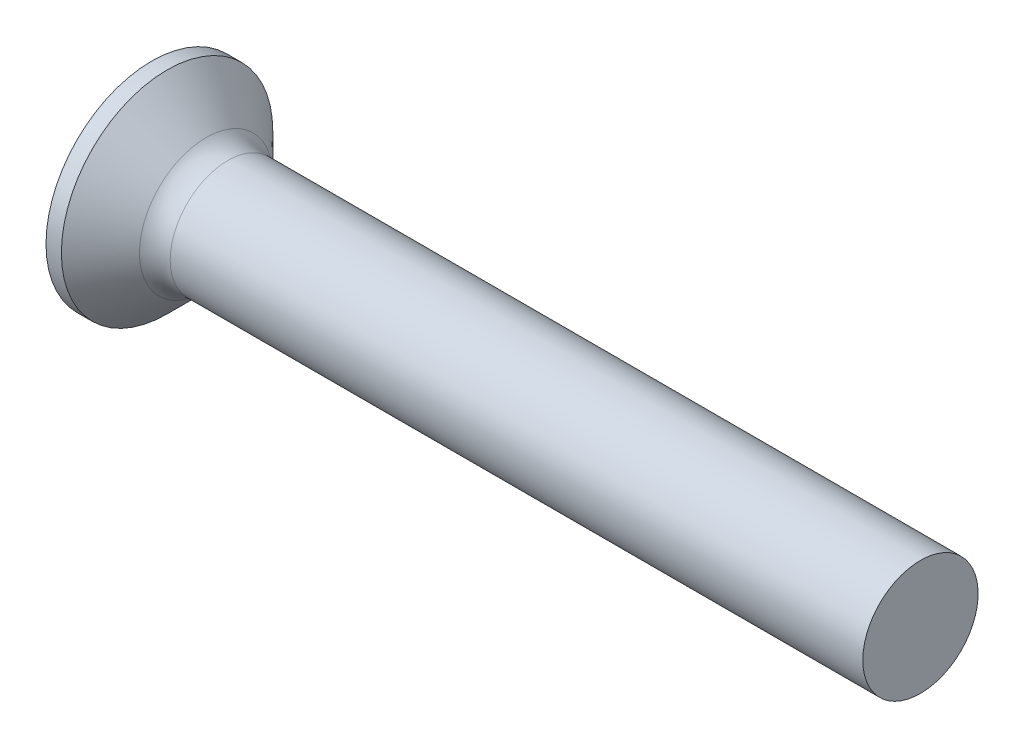
ISO-10303-21;
HEADER;
FILE_DESCRIPTION(('STEP AP214'),'2;1');
FILE_NAME('part.step','',(''),(''),'','','');
FILE_SCHEMA(('AUTOMOTIVE_DESIGN { 1 0 10303 214 1 1 1 1 }'));
ENDSEC;
DATA;
#1=APPLICATION_CONTEXT('core data for automotive mechanical design processes');
#2=APPLICATION_PROTOCOL_DEFINITION('international standard','automotive_design',2000,#1);
#3=PRODUCT_CONTEXT('',#1,'mechanical');
#4=PRODUCT('Part','Part','',(#3));
#5=PRODUCT_RELATED_PRODUCT_CATEGORY('part','',(#4));
#6=PRODUCT_DEFINITION_FORMATION('','',#4);
#7=PRODUCT_DEFINITION_CONTEXT('part definition',#1,'design');
#8=PRODUCT_DEFINITION('design','',#6,#7);
#9=PRODUCT_DEFINITION_SHAPE('','',#8);
#10=(LENGTH_UNIT() NAMED_UNIT(*) SI_UNIT(.MILLI.,.METRE.));
#11=(NAMED_UNIT(*) PLANE_ANGLE_UNIT() SI_UNIT($,.RADIAN.));
#12=(NAMED_UNIT(*) SI_UNIT($,.STERADIAN.) SOLID_ANGLE_UNIT());
#13=UNCERTAINTY_MEASURE_WITH_UNIT(LENGTH_MEASURE(1.E-05),#10,'distance_accuracy_value','');
#14=(GEOMETRIC_REPRESENTATION_CONTEXT(3) GLOBAL_UNCERTAINTY_ASSIGNED_CONTEXT((#13)) GLOBAL_UNIT_ASSIGNED_CONTEXT((#10,
#11,#12)) REPRESENTATION_CONTEXT('',''));
#15=CARTESIAN_POINT('',(0.,0.,0.));
#16=DIRECTION('',(0.,0.,1.));
#17=DIRECTION('',(1.,0.,0.));
#18=AXIS2_PLACEMENT_3D('',#15,#16,#17);
#19=CARTESIAN_POINT('',(2.01,-0.497851135403458,0.37));
#20=DIRECTION('',(0.,0.,-1.));
#21=DIRECTION('',(-1.,0.,0.));
#22=AXIS2_PLACEMENT_3D('',#19,#20,#21);
#23=PLANE('',#22);
#24=DIRECTION('',(0.,-1.,0.));
#25=VECTOR('',#24,1.);
#26=CARTESIAN_POINT('',(0.,1.5,0.37));
#27=LINE('',#26,#25);
#28=CARTESIAN_POINT('',(0.,-0.590157547916262,0.37));
#29=VERTEX_POINT('',#28);
#30=CARTESIAN_POINT('',(0.,-1.5,0.37));
#31=VERTEX_POINT('',#30);
#32=EDGE_CURVE('E461',#29,#31,#27,.T.);
#33=ORIENTED_EDGE('',*,*,#32,.F.);
#34=CARTESIAN_POINT('',(-1.01053649699026,-0.672102030078458,0.37));
#35=CARTESIAN_POINT('',(-0.799706058781647,-0.65526709888962,0.37));
#36=CARTESIAN_POINT('',(-0.588886212565098,-0.638297110577309,0.37));
#37=CARTESIAN_POINT('',(-0.167272662573758,-0.603984130523452,0.37));
#38=CARTESIAN_POINT('',(0.043521040593722,-0.586641131327184,0.37));
#39=CARTESIAN_POINT('',(0.465068838236452,-0.551479911668093,0.37));
#40=CARTESIAN_POINT('',(0.675822932725247,-0.533661691368078,0.37));
#41=CARTESIAN_POINT('',(1.09727362087867,-0.497387538868942,0.37));
#42=CARTESIAN_POINT('',(1.30797021528206,-0.478931615293403,0.37));
#43=CARTESIAN_POINT('',(1.67418894765493,-0.446067164114375,0.37));
#44=CARTESIAN_POINT('',(1.82972932594024,-0.431862501020784,0.37));
#45=CARTESIAN_POINT('',(2.14074770367772,-0.402797709732014,0.37));
#46=CARTESIAN_POINT('',(2.29622570364502,-0.387937587067169,0.37));
#47=CARTESIAN_POINT('',(2.60710169356699,-0.357305117929345,0.37));
#48=CARTESIAN_POINT('',(2.76249967848536,-0.341532719782114,0.37));
#49=CARTESIAN_POINT('',(2.99549070750468,-0.316847908272697,0.37));
#50=CARTESIAN_POINT('',(3.07313791127142,-0.308448465888147,0.37));
#51=CARTESIAN_POINT('',(3.22838341584044,-0.291202251038988,0.37));
#52=CARTESIAN_POINT('',(3.30598171607669,-0.282355473489552,0.370000000000001));
#53=CARTESIAN_POINT('',(3.38354828471668,-0.273232461280214,0.370000000000001));
#54=B_SPLINE_CURVE_WITH_KNOTS('',3,(#34,#35,#36,#37,#38,#39,#40,#41,#42,#43,#44,#45,#46,#47,#48,
#49,#50,#51,#52,#53),.UNSPECIFIED.,.F.,.F.,(4,2,2,2,2,2,2,2,2,4),(0.,0.634504777580944,
1.26902224771403,1.90353950046914,2.53804817608336,3.00661008454961,3.47516804035678,
3.94375256285268,4.17805198347564,4.41235406796205),.UNSPECIFIED.);
#55=CARTESIAN_POINT('',(2.01,-0.415013252800436,0.37));
#56=VERTEX_POINT('',#55);
#57=EDGE_CURVE('E217',#29,#56,#54,.T.);
#58=ORIENTED_EDGE('',*,*,#57,.T.);
#59=DIRECTION('',(0.,-1.,0.));
#60=VECTOR('',#59,1.);
#61=CARTESIAN_POINT('',(2.01,0.497851135403458,0.37));
#62=LINE('',#61,#60);
#63=CARTESIAN_POINT('',(2.01,-0.497851135403458,0.37));
#64=VERTEX_POINT('',#63);
#65=EDGE_CURVE('E370',#56,#64,#62,.T.);
#66=ORIENTED_EDGE('',*,*,#65,.T.);
#67=DIRECTION('',(0.894934391398442,0.446197753347436,0.));
#68=VECTOR('',#67,1.);
#69=CARTESIAN_POINT('',(0.,-1.5,0.37));
#70=LINE('',#69,#68);
#71=EDGE_CURVE('E469',#31,#64,#70,.T.);
#72=ORIENTED_EDGE('',*,*,#71,.F.);
#73=EDGE_LOOP('',(#33,#58,#66,#72));
#74=FACE_BOUND('',#73,.T.);
#75=ADVANCED_FACE('F38',(#74),#23,.T.);
#76=CARTESIAN_POINT('',(2.01,0.497851135403458,0.37));
#77=VERTEX_POINT('',#76);
#78=CARTESIAN_POINT('',(2.01,0.415013252800436,0.37));
#79=VERTEX_POINT('',#78);
#80=EDGE_CURVE('E366',#77,#79,#62,.T.);
#81=ORIENTED_EDGE('',*,*,#80,.T.);
#82=CARTESIAN_POINT('',(-1.01053649699026,0.672102030078458,0.37));
#83=CARTESIAN_POINT('',(-0.799706058781647,0.65526709888962,0.37));
#84=CARTESIAN_POINT('',(-0.588886212565098,0.638297110577309,0.37));
#85=CARTESIAN_POINT('',(-0.167272662573758,0.603984130523452,0.37));
#86=CARTESIAN_POINT('',(0.0435210405937223,0.586641131327184,0.37));
#87=CARTESIAN_POINT('',(0.465068838236453,0.551479911668093,0.37));
#88=CARTESIAN_POINT('',(0.675822932725247,0.533661691368078,0.37));
#89=CARTESIAN_POINT('',(1.09727362087867,0.497387538868942,0.37));
#90=CARTESIAN_POINT('',(1.30797021528206,0.478931615293403,0.37));
#91=CARTESIAN_POINT('',(1.67418894765493,0.446067164114375,0.37));
#92=CARTESIAN_POINT('',(1.82972932594024,0.431862501020784,0.37));
#93=CARTESIAN_POINT('',(2.14074770367772,0.402797709732014,0.37));
#94=CARTESIAN_POINT('',(2.29622570364503,0.387937587067169,0.37));
#95=CARTESIAN_POINT('',(2.60710169356699,0.357305117929345,0.37));
#96=CARTESIAN_POINT('',(2.76249967848536,0.341532719782114,0.37));
#97=CARTESIAN_POINT('',(2.99549070750468,0.316847908272697,0.37));
#98=CARTESIAN_POINT('',(3.07313791127142,0.308448465888147,0.37));
#99=CARTESIAN_POINT('',(3.22838341584044,0.291202251038988,0.37));
#100=CARTESIAN_POINT('',(3.30598171607669,0.282355473489552,0.37));
#101=CARTESIAN_POINT('',(3.38354828471668,0.273232461280214,0.37));
#102=B_SPLINE_CURVE_WITH_KNOTS('',3,(#82,#83,#84,#85,#86,#87,#88,#89,#90,#91,#92,#93,#94,#95,
#96,#97,#98,#99,#100,#101),.UNSPECIFIED.,.F.,.F.,(4,2,2,2,2,2,2,2,2,4),(0.,0.634504777580944,
1.26902224771403,1.90353950046914,2.53804817608336,3.00661008454961,3.47516804035678,
3.94375256285268,4.17805198347564,4.41235406796206),.UNSPECIFIED.);
#103=CARTESIAN_POINT('',(0.,0.590157547916262,0.37));
#104=VERTEX_POINT('',#103);
#105=EDGE_CURVE('E210',#79,#104,#102,.F.);
#106=ORIENTED_EDGE('',*,*,#105,.T.);
#107=CARTESIAN_POINT('',(0.,1.5,0.37));
#108=VERTEX_POINT('',#107);
#109=EDGE_CURVE('E463',#108,#104,#27,.T.);
#110=ORIENTED_EDGE('',*,*,#109,.F.);
#111=DIRECTION('',(0.894934391398442,-0.446197753347436,0.));
#112=VECTOR('',#111,1.);
#113=CARTESIAN_POINT('',(0.,1.5,0.37));
#114=LINE('',#113,#112);
#115=EDGE_CURVE('E61',#108,#77,#114,.T.);
#116=ORIENTED_EDGE('',*,*,#115,.T.);
#117=EDGE_LOOP('',(#81,#106,#110,#116));
#118=FACE_BOUND('',#117,.T.);
#119=ADVANCED_FACE('F192',(#118),#23,.T.);
#120=CARTESIAN_POINT('',(2.01,0.497851135403458,-0.37));
#121=DIRECTION('',(0.,0.,1.));
#122=DIRECTION('',(1.,0.,0.));
#123=AXIS2_PLACEMENT_3D('',#120,#121,#122);
#124=PLANE('',#123);
#125=DIRECTION('',(0.,1.,0.));
#126=VECTOR('',#125,1.);
#127=CARTESIAN_POINT('',(2.01,-0.497851135403458,-0.37));
#128=LINE('',#127,#126);
#129=CARTESIAN_POINT('',(2.01,-0.497851135403458,-0.37));
#130=VERTEX_POINT('',#129);
#131=CARTESIAN_POINT('',(2.01,-0.415013252800436,-0.37));
#132=VERTEX_POINT('',#131);
#133=EDGE_CURVE('E379',#130,#132,#128,.T.);
#134=ORIENTED_EDGE('',*,*,#133,.T.);
#135=CARTESIAN_POINT('',(-1.01053649699026,-0.672102030078459,-0.369999999999999));
#136=CARTESIAN_POINT('',(-0.799706058781647,-0.65526709888962,-0.369999999999999));
#137=CARTESIAN_POINT('',(-0.588886212565098,-0.63829711057731,-0.369999999999999));
#138=CARTESIAN_POINT('',(-0.167272662573758,-0.603984130523453,-0.369999999999999));
#139=CARTESIAN_POINT('',(0.0435210405937223,-0.586641131327185,-0.369999999999999));
#140=CARTESIAN_POINT('',(0.465068838236453,-0.551479911668094,-0.369999999999999));
#141=CARTESIAN_POINT('',(0.675822932725247,-0.533661691368078,-0.369999999999999));
#142=CARTESIAN_POINT('',(1.09727362087867,-0.497387538868943,-0.369999999999999));
#143=CARTESIAN_POINT('',(1.30797021528206,-0.478931615293404,-0.37));
#144=CARTESIAN_POINT('',(1.67418894765493,-0.446067164114376,-0.37));
#145=CARTESIAN_POINT('',(1.82972932594024,-0.431862501020785,-0.37));
#146=CARTESIAN_POINT('',(2.14074770367772,-0.402797709732015,-0.37));
#147=CARTESIAN_POINT('',(2.29622570364503,-0.387937587067169,-0.37));
#148=CARTESIAN_POINT('',(2.60710169356699,-0.357305117929345,-0.37));
#149=CARTESIAN_POINT('',(2.76249967848536,-0.341532719782114,-0.37));
#150=CARTESIAN_POINT('',(2.99549070750468,-0.316847908272697,-0.37));
#151=CARTESIAN_POINT('',(3.07313791127142,-0.308448465888147,-0.37));
#152=CARTESIAN_POINT('',(3.22838341584044,-0.291202251038988,-0.37));
#153=CARTESIAN_POINT('',(3.30598171607669,-0.282355473489552,-0.37));
#154=CARTESIAN_POINT('',(3.38354828471668,-0.273232461280214,-0.37));
#155=B_SPLINE_CURVE_WITH_KNOTS('',3,(#135,#136,#137,#138,#139,#140,#141,#142,#143,#144,#145,
#146,#147,#148,#149,#150,#151,#152,#153,#154),.UNSPECIFIED.,.F.,.F.,(4,2,2,2,2,2,2,2,2,4),(0.,
0.634504777580944,1.26902224771403,1.90353950046914,2.53804817608336,3.00661008454961,
3.47516804035678,3.94375256285268,4.17805198347564,4.41235406796206),.UNSPECIFIED.);
#156=CARTESIAN_POINT('',(0.,-0.590157547916263,-0.369999999999999));
#157=VERTEX_POINT('',#156);
#158=EDGE_CURVE('E273',#132,#157,#155,.F.);
#159=ORIENTED_EDGE('',*,*,#158,.T.);
#160=DIRECTION('',(0.,1.,0.));
#161=VECTOR('',#160,1.);
#162=CARTESIAN_POINT('',(0.,-1.5,-0.369999999999999));
#163=LINE('',#162,#161);
#164=CARTESIAN_POINT('',(0.,-1.5,-0.369999999999999));
#165=VERTEX_POINT('',#164);
#166=EDGE_CURVE('E462',#165,#157,#163,.T.);
#167=ORIENTED_EDGE('',*,*,#166,.F.);
#168=DIRECTION('',(0.894934391398442,0.446197753347436,0.));
#169=VECTOR('',#168,1.);
#170=CARTESIAN_POINT('',(0.,-1.5,-0.369999999999999));
#171=LINE('',#170,#169);
#172=EDGE_CURVE('E472',#165,#130,#171,.T.);
#173=ORIENTED_EDGE('',*,*,#172,.T.);
#174=EDGE_LOOP('',(#134,#159,#167,#173));
#175=FACE_BOUND('',#174,.T.);
#176=ADVANCED_FACE('F198',(#175),#124,.T.);
#177=CARTESIAN_POINT('',(0.,0.590157547916263,-0.369999999999999));
#178=VERTEX_POINT('',#177);
#179=CARTESIAN_POINT('',(0.,1.5,-0.369999999999999));
#180=VERTEX_POINT('',#179);
#181=EDGE_CURVE('E468',#178,#180,#163,.T.);
#182=ORIENTED_EDGE('',*,*,#181,.F.);
#183=CARTESIAN_POINT('',(-1.01053649699026,0.672102030078459,-0.369999999999999));
#184=CARTESIAN_POINT('',(-0.799706058781646,0.65526709888962,-0.369999999999999));
#185=CARTESIAN_POINT('',(-0.588886212565098,0.638297110577309,-0.369999999999999));
#186=CARTESIAN_POINT('',(-0.167272662573758,0.603984130523452,-0.369999999999999));
#187=CARTESIAN_POINT('',(0.0435210405937222,0.586641131327184,-0.369999999999999));
#188=CARTESIAN_POINT('',(0.465068838236452,0.551479911668094,-0.369999999999999));
#189=CARTESIAN_POINT('',(0.675822932725247,0.533661691368078,-0.369999999999999));
#190=CARTESIAN_POINT('',(1.09727362087867,0.497387538868942,-0.37));
#191=CARTESIAN_POINT('',(1.30797021528206,0.478931615293403,-0.37));
#192=CARTESIAN_POINT('',(1.67418894765493,0.446067164114375,-0.37));
#193=CARTESIAN_POINT('',(1.82972932594024,0.431862501020785,-0.37));
#194=CARTESIAN_POINT('',(2.14074770367772,0.402797709732015,-0.37));
#195=CARTESIAN_POINT('',(2.29622570364502,0.387937587067169,-0.37));
#196=CARTESIAN_POINT('',(2.60710169356699,0.357305117929345,-0.37));
#197=CARTESIAN_POINT('',(2.76249967848536,0.341532719782114,-0.37));
#198=CARTESIAN_POINT('',(2.99549070750468,0.316847908272697,-0.37));
#199=CARTESIAN_POINT('',(3.07313791127142,0.308448465888147,-0.37));
#200=CARTESIAN_POINT('',(3.22838341584044,0.291202251038988,-0.37));
#201=CARTESIAN_POINT('',(3.30598171607669,0.282355473489552,-0.37));
#202=CARTESIAN_POINT('',(3.38354828471668,0.273232461280214,-0.37));
#203=B_SPLINE_CURVE_WITH_KNOTS('',3,(#183,#184,#185,#186,#187,#188,#189,#190,#191,#192,#193,
#194,#195,#196,#197,#198,#199,#200,#201,#202),.UNSPECIFIED.,.F.,.F.,(4,2,2,2,2,2,2,2,2,4),(0.,
0.634504777580944,1.26902224771403,1.90353950046914,2.53804817608336,3.00661008454961,
3.47516804035678,3.94375256285268,4.17805198347564,4.41235406796206),.UNSPECIFIED.);
#204=CARTESIAN_POINT('',(2.01,0.415013252800436,-0.37));
#205=VERTEX_POINT('',#204);
#206=EDGE_CURVE('E267',#178,#205,#203,.T.);
#207=ORIENTED_EDGE('',*,*,#206,.T.);
#208=CARTESIAN_POINT('',(2.01,0.497851135403459,-0.37));
#209=VERTEX_POINT('',#208);
#210=EDGE_CURVE('E381',#205,#209,#128,.T.);
#211=ORIENTED_EDGE('',*,*,#210,.T.);
#212=DIRECTION('',(0.894934391398442,-0.446197753347436,0.));
#213=VECTOR('',#212,1.);
#214=CARTESIAN_POINT('',(0.,1.5,-0.369999999999999));
#215=LINE('',#214,#213);
#216=EDGE_CURVE('E378',#180,#209,#215,.T.);
#217=ORIENTED_EDGE('',*,*,#216,.F.);
#218=EDGE_LOOP('',(#182,#207,#211,#217));
#219=FACE_BOUND('',#218,.T.);
#220=ADVANCED_FACE('F479',(#219),#124,.T.);
#221=CARTESIAN_POINT('',(2.01,-0.497851135403458,-0.37));
#222=DIRECTION('',(-1.,0.,0.));
#223=DIRECTION('',(0.,0.,1.));
#224=AXIS2_PLACEMENT_3D('',#221,#222,#223);
#225=PLANE('',#224);
#226=DIRECTION('',(0.,-1.,0.));
#227=VECTOR('',#226,1.);
#228=CARTESIAN_POINT('',(2.01,0.369999999999998,0.49785113540346));
#229=LINE('',#228,#227);
#230=CARTESIAN_POINT('',(2.01,-0.247548473995472,0.497851135403457));
#231=VERTEX_POINT('',#230);
#232=CARTESIAN_POINT('',(2.01,-0.370000000000002,0.497851135403457));
#233=VERTEX_POINT('',#232);
#234=EDGE_CURVE('E451',#231,#233,#229,.T.);
#235=ORIENTED_EDGE('',*,*,#234,.F.);
#236=CARTESIAN_POINT('',(2.01,0.,0.));
#237=DIRECTION('',(-1.,0.,0.));
#238=DIRECTION('',(0.,0.,1.));
#239=AXIS2_PLACEMENT_3D('',#236,#237,#238);
#240=CIRCLE('',#239,0.555999999999999);
#241=CARTESIAN_POINT('',(2.01,-0.370000000000002,0.415013252800435));
#242=VERTEX_POINT('',#241);
#243=EDGE_CURVE('E53',#242,#231,#240,.T.);
#244=ORIENTED_EDGE('',*,*,#243,.F.);
#245=DIRECTION('',(0.,0.,-1.));
#246=VECTOR('',#245,1.);
#247=CARTESIAN_POINT('',(2.01,-0.370000000000002,0.497851135403457));
#248=LINE('',#247,#246);
#249=EDGE_CURVE('E452',#233,#242,#248,.T.);
#250=ORIENTED_EDGE('',*,*,#249,.F.);
#251=EDGE_LOOP('',(#235,#244,#250));
#252=FACE_BOUND('',#251,.T.);
#253=ADVANCED_FACE('F494',(#252),#225,.T.);
#254=ORIENTED_EDGE('',*,*,#65,.F.);
#255=CARTESIAN_POINT('',(2.01,-0.497851135403458,0.247548473995471));
#256=VERTEX_POINT('',#255);
#257=EDGE_CURVE('E335',#256,#56,#240,.T.);
#258=ORIENTED_EDGE('',*,*,#257,.F.);
#259=DIRECTION('',(0.,0.,-1.));
#260=VECTOR('',#259,1.);
#261=CARTESIAN_POINT('',(2.01,-0.497851135403458,0.37));
#262=LINE('',#261,#260);
#263=EDGE_CURVE('E372',#64,#256,#262,.T.);
#264=ORIENTED_EDGE('',*,*,#263,.F.);
#265=EDGE_LOOP('',(#254,#258,#264));
#266=FACE_BOUND('',#265,.T.);
#267=ADVANCED_FACE('F616',(#266),#225,.T.);
#268=CARTESIAN_POINT('',(2.01,-0.497851135403458,-0.247548473995471));
#269=VERTEX_POINT('',#268);
#270=EDGE_CURVE('E369',#269,#130,#262,.T.);
#271=ORIENTED_EDGE('',*,*,#270,.F.);
#272=EDGE_CURVE('E340',#132,#269,#240,.T.);
#273=ORIENTED_EDGE('',*,*,#272,.F.);
#274=ORIENTED_EDGE('',*,*,#133,.F.);
#275=EDGE_LOOP('',(#271,#273,#274));
#276=FACE_BOUND('',#275,.T.);
#277=ADVANCED_FACE('F627',(#276),#225,.T.);
#278=CARTESIAN_POINT('',(2.01,-0.369999999999999,-0.415013252800437));
#279=VERTEX_POINT('',#278);
#280=CARTESIAN_POINT('',(2.01,-0.369999999999999,-0.497851135403459));
#281=VERTEX_POINT('',#280);
#282=EDGE_CURVE('E450',#279,#281,#248,.T.);
#283=ORIENTED_EDGE('',*,*,#282,.F.);
#284=CARTESIAN_POINT('',(2.01,-0.24754847399547,-0.497851135403459));
#285=VERTEX_POINT('',#284);
#286=EDGE_CURVE('E345',#285,#279,#240,.T.);
#287=ORIENTED_EDGE('',*,*,#286,.F.);
#288=DIRECTION('',(0.,1.,0.));
#289=VECTOR('',#288,1.);
#290=CARTESIAN_POINT('',(2.01,-0.369999999999999,-0.497851135403459));
#291=LINE('',#290,#289);
#292=EDGE_CURVE('E446',#281,#285,#291,.T.);
#293=ORIENTED_EDGE('',*,*,#292,.F.);
#294=EDGE_LOOP('',(#283,#287,#293));
#295=FACE_BOUND('',#294,.T.);
#296=ADVANCED_FACE('F489',(#295),#225,.T.);
#297=CARTESIAN_POINT('',(2.01,0.247548473995473,-0.497851135403457));
#298=VERTEX_POINT('',#297);
#299=CARTESIAN_POINT('',(2.01,0.370000000000002,-0.497851135403457));
#300=VERTEX_POINT('',#299);
#301=EDGE_CURVE('E454',#298,#300,#291,.T.);
#302=ORIENTED_EDGE('',*,*,#301,.F.);
#303=CARTESIAN_POINT('',(2.01,0.370000000000001,-0.415013252800435));
#304=VERTEX_POINT('',#303);
#305=EDGE_CURVE('E350',#304,#298,#240,.T.);
#306=ORIENTED_EDGE('',*,*,#305,.F.);
#307=DIRECTION('',(0.,0.,1.));
#308=VECTOR('',#307,1.);
#309=CARTESIAN_POINT('',(2.01,0.370000000000002,-0.497851135403457));
#310=LINE('',#309,#308);
#311=EDGE_CURVE('E456',#300,#304,#310,.T.);
#312=ORIENTED_EDGE('',*,*,#311,.F.);
#313=EDGE_LOOP('',(#302,#306,#312));
#314=FACE_BOUND('',#313,.T.);
#315=ADVANCED_FACE('F483',(#314),#225,.T.);
#316=ORIENTED_EDGE('',*,*,#210,.F.);
#317=CARTESIAN_POINT('',(2.01,0.497851135403458,-0.247548473995471));
#318=VERTEX_POINT('',#317);
#319=EDGE_CURVE('E355',#318,#205,#240,.T.);
#320=ORIENTED_EDGE('',*,*,#319,.F.);
#321=DIRECTION('',(0.,0.,1.));
#322=VECTOR('',#321,1.);
#323=CARTESIAN_POINT('',(2.01,0.497851135403459,-0.37));
#324=LINE('',#323,#322);
#325=EDGE_CURVE('E374',#209,#318,#324,.T.);
#326=ORIENTED_EDGE('',*,*,#325,.F.);
#327=EDGE_LOOP('',(#316,#320,#326));
#328=FACE_BOUND('',#327,.T.);
#329=ADVANCED_FACE('F481',(#328),#225,.T.);
#330=CARTESIAN_POINT('',(2.01,0.497851135403458,0.24754847399547));
#331=VERTEX_POINT('',#330);
#332=EDGE_CURVE('E367',#331,#77,#324,.T.);
#333=ORIENTED_EDGE('',*,*,#332,.F.);
#334=EDGE_CURVE('E333',#79,#331,#240,.T.);
#335=ORIENTED_EDGE('',*,*,#334,.F.);
#336=ORIENTED_EDGE('',*,*,#80,.F.);
#337=EDGE_LOOP('',(#333,#335,#336));
#338=FACE_BOUND('',#337,.T.);
#339=ADVANCED_FACE('F365',(#338),#225,.T.);
#340=CARTESIAN_POINT('',(0.,-1.5,-0.369999999999999));
#341=DIRECTION('',(-0.446197753347436,0.894934391398443,0.));
#342=DIRECTION('',(-0.894934391398442,-0.446197753347436,0.));
#343=AXIS2_PLACEMENT_3D('',#340,#341,#342);
#344=PLANE('',#343);
#345=ORIENTED_EDGE('',*,*,#263,.T.);
#346=CARTESIAN_POINT('',(2.86902919914418,-0.0695550475538963,0.));
#347=DIRECTION('',(-0.446197753347436,0.894934391398443,0.));
#348=DIRECTION('',(-0.894934391398443,-0.446197753347436,0.));
#349=AXIS2_PLACEMENT_3D('',#346,#347,#348);
#350=ELLIPSE('',#349,1.11145971268776,0.491029001453358);
#351=EDGE_CURVE('E285',#256,#269,#350,.F.);
#352=ORIENTED_EDGE('',*,*,#351,.T.);
#353=ORIENTED_EDGE('',*,*,#270,.T.);
#354=ORIENTED_EDGE('',*,*,#172,.F.);
#355=DIRECTION('',(0.,0.,-1.));
#356=VECTOR('',#355,1.);
#357=CARTESIAN_POINT('',(0.,-1.5,0.37));
#358=LINE('',#357,#356);
#359=EDGE_CURVE('E386',#31,#165,#358,.T.);
#360=ORIENTED_EDGE('',*,*,#359,.F.);
#361=ORIENTED_EDGE('',*,*,#71,.T.);
#362=EDGE_LOOP('',(#345,#352,#353,#354,#360,#361));
#363=FACE_BOUND('',#362,.T.);
#364=ADVANCED_FACE('F204',(#363),#344,.T.);
#365=CARTESIAN_POINT('',(0.,1.5,0.37));
#366=DIRECTION('',(-0.446197753347436,-0.894934391398443,0.));
#367=DIRECTION('',(0.894934391398442,-0.446197753347436,0.));
#368=AXIS2_PLACEMENT_3D('',#365,#366,#367);
#369=PLANE('',#368);
#370=ORIENTED_EDGE('',*,*,#325,.T.);
#371=CARTESIAN_POINT('',(2.86902919914418,0.0695550475538961,0.));
#372=DIRECTION('',(-0.446197753347436,-0.894934391398443,0.));
#373=DIRECTION('',(-0.894934391398443,0.446197753347436,0.));
#374=AXIS2_PLACEMENT_3D('',#371,#372,#373);
#375=ELLIPSE('',#374,1.11145971268776,0.491029001453358);
#376=EDGE_CURVE('E290',#318,#331,#375,.F.);
#377=ORIENTED_EDGE('',*,*,#376,.T.);
#378=ORIENTED_EDGE('',*,*,#332,.T.);
#379=ORIENTED_EDGE('',*,*,#115,.F.);
#380=DIRECTION('',(0.,0.,1.));
#381=VECTOR('',#380,1.);
#382=CARTESIAN_POINT('',(0.,1.5,-0.369999999999999));
#383=LINE('',#382,#381);
#384=EDGE_CURVE('E458',#180,#108,#383,.T.);
#385=ORIENTED_EDGE('',*,*,#384,.F.);
#386=ORIENTED_EDGE('',*,*,#216,.T.);
#387=EDGE_LOOP('',(#370,#377,#378,#379,#385,#386));
#388=FACE_BOUND('',#387,.T.);
#389=ADVANCED_FACE('F477',(#388),#369,.T.);
#390=CARTESIAN_POINT('',(2.01,-0.369999999999999,-0.497851135403459));
#391=DIRECTION('',(0.,1.,0.));
#392=DIRECTION('',(-1.,0.,0.));
#393=AXIS2_PLACEMENT_3D('',#390,#391,#392);
#394=PLANE('',#393);
#395=DIRECTION('',(0.,0.,-1.));
#396=VECTOR('',#395,1.);
#397=CARTESIAN_POINT('',(0.,-0.370000000000005,1.5));
#398=LINE('',#397,#396);
#399=CARTESIAN_POINT('',(0.,-0.369999999999998,-0.590157547916264));
#400=VERTEX_POINT('',#399);
#401=CARTESIAN_POINT('',(0.,-0.369999999999995,-1.5));
#402=VERTEX_POINT('',#401);
#403=EDGE_CURVE('E428',#400,#402,#398,.T.);
#404=ORIENTED_EDGE('',*,*,#403,.F.);
#405=CARTESIAN_POINT('',(-1.01053649691082,-0.369999999999997,-0.672102030072118));
#406=CARTESIAN_POINT('',(-0.799706058711029,-0.369999999999998,-0.655267098883948));
#407=CARTESIAN_POINT('',(-0.588886212503303,-0.369999999999998,-0.638297110572312));
#408=CARTESIAN_POINT('',(-0.167272662529609,-0.369999999999998,-0.603984130519828));
#409=CARTESIAN_POINT('',(0.0435210406290478,-0.369999999999998,-0.586641131324259));
#410=CARTESIAN_POINT('',(0.465068838244709,-0.369999999999998,-0.551479911667386));
#411=CARTESIAN_POINT('',(0.67582293271526,-0.369999999999998,-0.53366169136891));
#412=CARTESIAN_POINT('',(1.09727362083221,-0.369999999999998,-0.497387538872971));
#413=CARTESIAN_POINT('',(1.30797021521736,-0.369999999999999,-0.47893161529909));
#414=CARTESIAN_POINT('',(1.67418894757201,-0.369999999999999,-0.446067164121906));
#415=CARTESIAN_POINT('',(1.82972932585734,-0.369999999999999,-0.431862501028415));
#416=CARTESIAN_POINT('',(2.14074770359484,-0.369999999999999,-0.40279770973988));
#417=CARTESIAN_POINT('',(2.29622570356215,-0.369999999999999,-0.38793758707517));
#418=CARTESIAN_POINT('',(2.60710169348415,-0.369999999999999,-0.357305117937677));
#419=CARTESIAN_POINT('',(2.76249967840253,-0.369999999999999,-0.34153271979064));
#420=CARTESIAN_POINT('',(2.99549070742189,-0.369999999999999,-0.316847908281594));
#421=CARTESIAN_POINT('',(3.07313791118864,-0.369999999999999,-0.308448465897182));
#422=CARTESIAN_POINT('',(3.22838341575769,-0.369999999999999,-0.291202251048339));
#423=CARTESIAN_POINT('',(3.30598171599396,-0.37,-0.282355473499082));
#424=CARTESIAN_POINT('',(3.38354828463398,-0.37,-0.27323246128995));
#425=B_SPLINE_CURVE_WITH_KNOTS('',3,(#405,#406,#407,#408,#409,#410,#411,#412,#413,#414,#415,
#416,#417,#418,#419,#420,#421,#422,#423,#424),.UNSPECIFIED.,.F.,.F.,(4,2,2,2,2,2,2,2,2,4),(0.,
0.634504777554396,1.26902224766093,1.90353950036111,2.53804817592041,3.00661008438666,
3.47516804019383,3.94375256268972,4.17805198331267,4.41235406779909),.UNSPECIFIED.);
#426=EDGE_CURVE('E259',#400,#279,#425,.T.);
#427=ORIENTED_EDGE('',*,*,#426,.T.);
#428=ORIENTED_EDGE('',*,*,#282,.T.);
#429=DIRECTION('',(0.894934391398442,0.,0.446197753347436));
#430=VECTOR('',#429,1.);
#431=CARTESIAN_POINT('',(0.,-0.369999999999995,-1.5));
#432=LINE('',#431,#430);
#433=EDGE_CURVE('E435',#402,#281,#432,.T.);
#434=ORIENTED_EDGE('',*,*,#433,.F.);
#435=EDGE_LOOP('',(#404,#427,#428,#434));
#436=FACE_BOUND('',#435,.T.);
#437=ADVANCED_FACE('F681',(#436),#394,.T.);
#438=CARTESIAN_POINT('',(2.01,0.369999999999998,0.49785113540346));
#439=DIRECTION('',(0.,-1.,0.));
#440=DIRECTION('',(1.,0.,0.));
#441=AXIS2_PLACEMENT_3D('',#438,#439,#440);
#442=PLANE('',#441);
#443=ORIENTED_EDGE('',*,*,#311,.T.);
#444=CARTESIAN_POINT('',(-1.01053649691082,0.370000000000001,-0.672102030072116));
#445=CARTESIAN_POINT('',(-0.799706058711029,0.370000000000001,-0.655267098883946));
#446=CARTESIAN_POINT('',(-0.588886212503304,0.370000000000001,-0.63829711057231));
#447=CARTESIAN_POINT('',(-0.16727266252961,0.370000000000001,-0.603984130519826));
#448=CARTESIAN_POINT('',(0.0435210406290473,0.370000000000001,-0.586641131324257));
#449=CARTESIAN_POINT('',(0.465068838244709,0.370000000000001,-0.551479911667383));
#450=CARTESIAN_POINT('',(0.67582293271526,0.370000000000001,-0.533661691368908));
#451=CARTESIAN_POINT('',(1.09727362083221,0.370000000000001,-0.497387538872969));
#452=CARTESIAN_POINT('',(1.30797021521736,0.370000000000001,-0.478931615299088));
#453=CARTESIAN_POINT('',(1.67418894757201,0.370000000000001,-0.446067164121904));
#454=CARTESIAN_POINT('',(1.82972932585734,0.370000000000001,-0.431862501028413));
#455=CARTESIAN_POINT('',(2.14074770359484,0.370000000000001,-0.402797709739878));
#456=CARTESIAN_POINT('',(2.29622570356215,0.370000000000001,-0.387937587075168));
#457=CARTESIAN_POINT('',(2.60710169348415,0.370000000000001,-0.357305117937674));
#458=CARTESIAN_POINT('',(2.76249967840253,0.370000000000001,-0.341532719790638));
#459=CARTESIAN_POINT('',(2.99549070742189,0.370000000000001,-0.316847908281592));
#460=CARTESIAN_POINT('',(3.07313791118864,0.370000000000001,-0.30844846589718));
#461=CARTESIAN_POINT('',(3.22838341575769,0.370000000000001,-0.291202251048337));
#462=CARTESIAN_POINT('',(3.30598171599396,0.370000000000001,-0.28235547349908));
#463=CARTESIAN_POINT('',(3.38354828463398,0.370000000000001,-0.273232461289948));
#464=B_SPLINE_CURVE_WITH_KNOTS('',3,(#444,#445,#446,#447,#448,#449,#450,#451,#452,#453,#454,
#455,#456,#457,#458,#459,#460,#461,#462,#463),.UNSPECIFIED.,.F.,.F.,(4,2,2,2,2,2,2,2,2,4),(0.,
0.634504777554396,1.26902224766093,1.90353950036111,2.53804817592041,3.00661008438666,
3.47516804019383,3.94375256268972,4.17805198331267,4.41235406779909),.UNSPECIFIED.);
#465=CARTESIAN_POINT('',(0.,0.370000000000001,-0.590157547916262));
#466=VERTEX_POINT('',#465);
#467=EDGE_CURVE('E252',#304,#466,#464,.F.);
#468=ORIENTED_EDGE('',*,*,#467,.T.);
#469=DIRECTION('',(0.,0.,1.));
#470=VECTOR('',#469,1.);
#471=CARTESIAN_POINT('',(0.,0.370000000000004,-1.5));
#472=LINE('',#471,#470);
#473=CARTESIAN_POINT('',(0.,0.370000000000004,-1.5));
#474=VERTEX_POINT('',#473);
#475=EDGE_CURVE('E432',#474,#466,#472,.T.);
#476=ORIENTED_EDGE('',*,*,#475,.F.);
#477=DIRECTION('',(0.894934391398442,0.,0.446197753347436));
#478=VECTOR('',#477,1.);
#479=CARTESIAN_POINT('',(0.,0.370000000000004,-1.5));
#480=LINE('',#479,#478);
#481=EDGE_CURVE('E438',#474,#300,#480,.T.);
#482=ORIENTED_EDGE('',*,*,#481,.T.);
#483=EDGE_LOOP('',(#443,#468,#476,#482));
#484=FACE_BOUND('',#483,.T.);
#485=ADVANCED_FACE('F689',(#484),#442,.T.);
#486=CARTESIAN_POINT('',(0.,0.370000000000004,-1.5));
#487=DIRECTION('',(-0.446197753347436,0.,0.894934391398443));
#488=DIRECTION('',(-0.894934391398442,0.,-0.446197753347436));
#489=AXIS2_PLACEMENT_3D('',#486,#487,#488);
#490=PLANE('',#489);
#491=ORIENTED_EDGE('',*,*,#292,.T.);
#492=CARTESIAN_POINT('',(2.86902919914418,0.,-0.0695550475538963));
#493=DIRECTION('',(-0.446197753347436,0.,0.894934391398443));
#494=DIRECTION('',(-0.894934391398443,0.,-0.446197753347436));
#495=AXIS2_PLACEMENT_3D('',#492,#493,#494);
#496=ELLIPSE('',#495,1.11145971268776,0.491029001453358);
#497=EDGE_CURVE('E302',#285,#298,#496,.F.);
#498=ORIENTED_EDGE('',*,*,#497,.T.);
#499=ORIENTED_EDGE('',*,*,#301,.T.);
#500=ORIENTED_EDGE('',*,*,#481,.F.);
#501=DIRECTION('',(0.,1.,0.));
#502=VECTOR('',#501,1.);
#503=CARTESIAN_POINT('',(0.,-0.369999999999995,-1.5));
#504=LINE('',#503,#502);
#505=EDGE_CURVE('E427',#402,#474,#504,.T.);
#506=ORIENTED_EDGE('',*,*,#505,.F.);
#507=ORIENTED_EDGE('',*,*,#433,.T.);
#508=EDGE_LOOP('',(#491,#498,#499,#500,#506,#507));
#509=FACE_BOUND('',#508,.T.);
#510=ADVANCED_FACE('F229',(#509),#490,.T.);
#511=ORIENTED_EDGE('',*,*,#249,.T.);
#512=CARTESIAN_POINT('',(-1.01053649691082,-0.370000000000002,0.672102030072116));
#513=CARTESIAN_POINT('',(-0.799706058711029,-0.370000000000002,0.655267098883945));
#514=CARTESIAN_POINT('',(-0.588886212503304,-0.370000000000002,0.638297110572309));
#515=CARTESIAN_POINT('',(-0.16727266252961,-0.370000000000002,0.603984130519826));
#516=CARTESIAN_POINT('',(0.0435210406290474,-0.370000000000002,0.586641131324257));
#517=CARTESIAN_POINT('',(0.465068838244709,-0.370000000000002,0.551479911667383));
#518=CARTESIAN_POINT('',(0.67582293271526,-0.370000000000002,0.533661691368907));
#519=CARTESIAN_POINT('',(1.09727362083221,-0.370000000000002,0.497387538872969));
#520=CARTESIAN_POINT('',(1.30797021521736,-0.370000000000002,0.478931615299087));
#521=CARTESIAN_POINT('',(1.67418894757201,-0.370000000000002,0.446067164121903));
#522=CARTESIAN_POINT('',(1.82972932585734,-0.370000000000002,0.431862501028412));
#523=CARTESIAN_POINT('',(2.14074770359484,-0.370000000000002,0.402797709739878));
#524=CARTESIAN_POINT('',(2.29622570356215,-0.370000000000002,0.387937587075168));
#525=CARTESIAN_POINT('',(2.60710169348415,-0.370000000000002,0.357305117937674));
#526=CARTESIAN_POINT('',(2.76249967840253,-0.370000000000002,0.341532719790637));
#527=CARTESIAN_POINT('',(2.99549070742189,-0.370000000000001,0.316847908281592));
#528=CARTESIAN_POINT('',(3.07313791118864,-0.370000000000001,0.30844846589718));
#529=CARTESIAN_POINT('',(3.22838341575769,-0.370000000000001,0.291202251048337));
#530=CARTESIAN_POINT('',(3.30598171599396,-0.370000000000001,0.28235547349908));
#531=CARTESIAN_POINT('',(3.38354828463398,-0.370000000000001,0.273232461289948));
#532=B_SPLINE_CURVE_WITH_KNOTS('',3,(#512,#513,#514,#515,#516,#517,#518,#519,#520,#521,#522,
#523,#524,#525,#526,#527,#528,#529,#530,#531),.UNSPECIFIED.,.F.,.F.,(4,2,2,2,2,2,2,2,2,4),(0.,
0.634504777554396,1.26902224766093,1.90353950036111,2.53804817592041,3.00661008438666,
3.47516804019383,3.94375256268972,4.17805198331267,4.41235406779909),.UNSPECIFIED.);
#533=CARTESIAN_POINT('',(0.,-0.370000000000002,0.590157547916261));
#534=VERTEX_POINT('',#533);
#535=EDGE_CURVE('E244',#242,#534,#532,.F.);
#536=ORIENTED_EDGE('',*,*,#535,.T.);
#537=CARTESIAN_POINT('',(0.,-0.370000000000005,1.5));
#538=VERTEX_POINT('',#537);
#539=EDGE_CURVE('E423',#538,#534,#398,.T.);
#540=ORIENTED_EDGE('',*,*,#539,.F.);
#541=DIRECTION('',(0.894934391398442,0.,-0.446197753347436));
#542=VECTOR('',#541,1.);
#543=CARTESIAN_POINT('',(0.,-0.370000000000005,1.5));
#544=LINE('',#543,#542);
#545=EDGE_CURVE('E441',#538,#233,#544,.T.);
#546=ORIENTED_EDGE('',*,*,#545,.T.);
#547=EDGE_LOOP('',(#511,#536,#540,#546));
#548=FACE_BOUND('',#547,.T.);
#549=ADVANCED_FACE('F690',(#548),#394,.T.);
#550=CARTESIAN_POINT('',(0.,0.369999999999997,0.590157547916264));
#551=VERTEX_POINT('',#550);
#552=CARTESIAN_POINT('',(0.,0.369999999999994,1.5));
#553=VERTEX_POINT('',#552);
#554=EDGE_CURVE('E434',#551,#553,#472,.T.);
#555=ORIENTED_EDGE('',*,*,#554,.F.);
#556=CARTESIAN_POINT('',(-1.01053649691082,0.369999999999996,0.672102030072119));
#557=CARTESIAN_POINT('',(-0.799706058711029,0.369999999999997,0.655267098883949));
#558=CARTESIAN_POINT('',(-0.588886212503304,0.369999999999997,0.638297110572313));
#559=CARTESIAN_POINT('',(-0.16727266252961,0.369999999999997,0.603984130519829));
#560=CARTESIAN_POINT('',(0.0435210406290474,0.369999999999997,0.58664113132426));
#561=CARTESIAN_POINT('',(0.465068838244709,0.369999999999997,0.551479911667386));
#562=CARTESIAN_POINT('',(0.67582293271526,0.369999999999998,0.53366169136891));
#563=CARTESIAN_POINT('',(1.09727362083221,0.369999999999998,0.497387538872972));
#564=CARTESIAN_POINT('',(1.30797021521736,0.369999999999998,0.47893161529909));
#565=CARTESIAN_POINT('',(1.67418894757201,0.369999999999998,0.446067164121906));
#566=CARTESIAN_POINT('',(1.82972932585734,0.369999999999998,0.431862501028415));
#567=CARTESIAN_POINT('',(2.14074770359484,0.369999999999999,0.40279770973988));
#568=CARTESIAN_POINT('',(2.29622570356215,0.369999999999999,0.387937587075171));
#569=CARTESIAN_POINT('',(2.60710169348415,0.369999999999999,0.357305117937677));
#570=CARTESIAN_POINT('',(2.76249967840253,0.369999999999999,0.34153271979064));
#571=CARTESIAN_POINT('',(2.99549070742189,0.369999999999999,0.316847908281595));
#572=CARTESIAN_POINT('',(3.07313791118864,0.369999999999999,0.308448465897182));
#573=CARTESIAN_POINT('',(3.22838341575769,0.369999999999999,0.291202251048339));
#574=CARTESIAN_POINT('',(3.30598171599396,0.369999999999999,0.282355473499082));
#575=CARTESIAN_POINT('',(3.38354828463398,0.37,0.273232461289951));
#576=B_SPLINE_CURVE_WITH_KNOTS('',3,(#556,#557,#558,#559,#560,#561,#562,#563,#564,#565,#566,
#567,#568,#569,#570,#571,#572,#573,#574,#575),.UNSPECIFIED.,.F.,.F.,(4,2,2,2,2,2,2,2,2,4),(0.,
0.634504777554396,1.26902224766093,1.90353950036111,2.53804817592041,3.00661008438666,
3.47516804019383,3.94375256268972,4.17805198331267,4.41235406779909),.UNSPECIFIED.);
#577=CARTESIAN_POINT('',(2.01,0.369999999999999,0.415013252800437));
#578=VERTEX_POINT('',#577);
#579=EDGE_CURVE('E234',#551,#578,#576,.T.);
#580=ORIENTED_EDGE('',*,*,#579,.T.);
#581=CARTESIAN_POINT('',(2.01,0.369999999999998,0.49785113540346));
#582=VERTEX_POINT('',#581);
#583=EDGE_CURVE('E224',#578,#582,#310,.T.);
#584=ORIENTED_EDGE('',*,*,#583,.T.);
#585=DIRECTION('',(0.894934391398442,0.,-0.446197753347436));
#586=VECTOR('',#585,1.);
#587=CARTESIAN_POINT('',(0.,0.369999999999994,1.5));
#588=LINE('',#587,#586);
#589=EDGE_CURVE('E443',#553,#582,#588,.T.);
#590=ORIENTED_EDGE('',*,*,#589,.F.);
#591=EDGE_LOOP('',(#555,#580,#584,#590));
#592=FACE_BOUND('',#591,.T.);
#593=ADVANCED_FACE('F698',(#592),#442,.T.);
#594=CARTESIAN_POINT('',(0.,-0.370000000000005,1.5));
#595=DIRECTION('',(-0.446197753347436,0.,-0.894934391398443));
#596=DIRECTION('',(0.894934391398442,0.,-0.446197753347436));
#597=AXIS2_PLACEMENT_3D('',#594,#595,#596);
#598=PLANE('',#597);
#599=CARTESIAN_POINT('',(2.01,0.247548473995469,0.497851135403459));
#600=VERTEX_POINT('',#599);
#601=EDGE_CURVE('E447',#582,#600,#229,.T.);
#602=ORIENTED_EDGE('',*,*,#601,.T.);
#603=CARTESIAN_POINT('',(2.86902919914418,0.,0.0695550475538961));
#604=DIRECTION('',(-0.446197753347436,0.,-0.894934391398443));
#605=DIRECTION('',(-0.894934391398443,0.,0.446197753347436));
#606=AXIS2_PLACEMENT_3D('',#603,#604,#605);
#607=ELLIPSE('',#606,1.11145971268776,0.491029001453358);
#608=EDGE_CURVE('E11',#600,#231,#607,.F.);
#609=ORIENTED_EDGE('',*,*,#608,.T.);
#610=ORIENTED_EDGE('',*,*,#234,.T.);
#611=ORIENTED_EDGE('',*,*,#545,.F.);
#612=DIRECTION('',(0.,-1.,0.));
#613=VECTOR('',#612,1.);
#614=CARTESIAN_POINT('',(0.,0.369999999999994,1.5));
#615=LINE('',#614,#613);
#616=EDGE_CURVE('E225',#553,#538,#615,.T.);
#617=ORIENTED_EDGE('',*,*,#616,.F.);
#618=ORIENTED_EDGE('',*,*,#589,.T.);
#619=EDGE_LOOP('',(#602,#609,#610,#611,#617,#618));
#620=FACE_BOUND('',#619,.T.);
#621=ADVANCED_FACE('F421',(#620),#598,.T.);
#622=CARTESIAN_POINT('',(0.,0.,0.));
#623=DIRECTION('',(-1.,0.,0.));
#624=DIRECTION('',(0.,0.,1.));
#625=AXIS2_PLACEMENT_3D('',#622,#623,#624);
#626=PLANE('',#625);
#627=CARTESIAN_POINT('',(0.,0.,0.));
#628=DIRECTION('',(-1.,0.,0.));
#629=DIRECTION('',(0.,0.,1.));
#630=AXIS2_PLACEMENT_3D('',#627,#628,#629);
#631=CIRCLE('',#630,2.75);
#632=CARTESIAN_POINT('',(0.,0.,2.75));
#633=VERTEX_POINT('',#632);
#634=EDGE_CURVE('E389',#633,#633,#631,.T.);
#635=ORIENTED_EDGE('',*,*,#634,.T.);
#636=EDGE_LOOP('',(#635));
#637=FACE_BOUND('',#636,.T.);
#638=ORIENTED_EDGE('',*,*,#539,.T.);
#639=CARTESIAN_POINT('',(0.,0.,0.));
#640=DIRECTION('',(-1.,0.,0.));
#641=DIRECTION('',(0.,0.,1.));
#642=AXIS2_PLACEMENT_3D('',#639,#640,#641);
#643=CIRCLE('',#642,0.69655289200644);
#644=EDGE_CURVE('E321',#29,#534,#643,.T.);
#645=ORIENTED_EDGE('',*,*,#644,.F.);
#646=ORIENTED_EDGE('',*,*,#32,.T.);
#647=ORIENTED_EDGE('',*,*,#359,.T.);
#648=ORIENTED_EDGE('',*,*,#166,.T.);
#649=EDGE_CURVE('E324',#400,#157,#643,.T.);
#650=ORIENTED_EDGE('',*,*,#649,.F.);
#651=ORIENTED_EDGE('',*,*,#403,.T.);
#652=ORIENTED_EDGE('',*,*,#505,.T.);
#653=ORIENTED_EDGE('',*,*,#475,.T.);
#654=EDGE_CURVE('E320',#178,#466,#643,.T.);
#655=ORIENTED_EDGE('',*,*,#654,.F.);
#656=ORIENTED_EDGE('',*,*,#181,.T.);
#657=ORIENTED_EDGE('',*,*,#384,.T.);
#658=ORIENTED_EDGE('',*,*,#109,.T.);
#659=EDGE_CURVE('E316',#551,#104,#643,.T.);
#660=ORIENTED_EDGE('',*,*,#659,.F.);
#661=ORIENTED_EDGE('',*,*,#554,.T.);
#662=ORIENTED_EDGE('',*,*,#616,.T.);
#663=EDGE_LOOP('',(#638,#645,#646,#647,#648,#650,#651,#652,#653,#655,#656,#657,#658,#660,#661,#662));
#664=FACE_BOUND('',#663,.T.);
#665=ADVANCED_FACE('F415',(#637,#664),#626,.T.);
#666=CARTESIAN_POINT('',(-6.34999999999999,0.,0.));
#667=DIRECTION('',(-1.,0.,0.));
#668=DIRECTION('',(0.,0.,1.));
#669=AXIS2_PLACEMENT_3D('',#666,#667,#668);
#670=CYLINDRICAL_SURFACE('',#669,2.75);
#671=CARTESIAN_POINT('',(0.400000000000005,0.,0.));
#672=DIRECTION('',(-1.,0.,0.));
#673=DIRECTION('',(0.,0.,1.));
#674=AXIS2_PLACEMENT_3D('',#671,#672,#673);
#675=CIRCLE('',#674,2.75);
#676=CARTESIAN_POINT('',(0.400000000000005,0.,2.75));
#677=VERTEX_POINT('',#676);
#678=EDGE_CURVE('E385',#677,#677,#675,.T.);
#679=ORIENTED_EDGE('',*,*,#678,.T.);
#680=EDGE_LOOP('',(#679));
#681=FACE_BOUND('',#680,.T.);
#682=ORIENTED_EDGE('',*,*,#634,.F.);
#683=EDGE_LOOP('',(#682));
#684=FACE_BOUND('',#683,.T.);
#685=ADVANCED_FACE('F409',(#681,#684),#670,.T.);
#686=CARTESIAN_POINT('',(0.400000000000005,0.,0.));
#687=DIRECTION('',(-1.,0.,0.));
#688=DIRECTION('',(0.,0.,1.));
#689=AXIS2_PLACEMENT_3D('',#686,#687,#688);
#690=CONICAL_SURFACE('',#689,2.75,0.78539816339745);
#691=CARTESIAN_POINT('',(1.41568542494924,0.,0.));
#692=DIRECTION('',(-1.,0.,0.));
#693=DIRECTION('',(0.,0.,1.));
#694=AXIS2_PLACEMENT_3D('',#691,#692,#693);
#695=CIRCLE('',#694,1.73431457505076);
#696=CARTESIAN_POINT('',(1.41568542494924,0.,1.73431457505076));
#697=VERTEX_POINT('',#696);
#698=EDGE_CURVE('E392',#697,#697,#695,.T.);
#699=ORIENTED_EDGE('',*,*,#698,.T.);
#700=EDGE_LOOP('',(#699));
#701=FACE_BOUND('',#700,.T.);
#702=ORIENTED_EDGE('',*,*,#678,.F.);
#703=EDGE_LOOP('',(#702));
#704=FACE_BOUND('',#703,.T.);
#705=ADVANCED_FACE('F406',(#701,#704),#690,.T.);
#706=CARTESIAN_POINT('',(-6.34999999999999,0.,0.));
#707=DIRECTION('',(-1.,0.,0.));
#708=DIRECTION('',(0.,0.,1.));
#709=AXIS2_PLACEMENT_3D('',#706,#707,#708);
#710=CYLINDRICAL_SURFACE('',#709,1.5);
#711=CARTESIAN_POINT('',(1.98137084989848,0.,0.));
#712=DIRECTION('',(-1.,0.,0.));
#713=DIRECTION('',(0.,0.,1.));
#714=AXIS2_PLACEMENT_3D('',#711,#712,#713);
#715=CIRCLE('',#714,1.5);
#716=CARTESIAN_POINT('',(1.98137084989848,0.,1.5));
#717=VERTEX_POINT('',#716);
#718=EDGE_CURVE('E46',#717,#717,#715,.F.);
#719=ORIENTED_EDGE('',*,*,#718,.T.);
#720=EDGE_LOOP('',(#719));
#721=FACE_BOUND('',#720,.T.);
#722=CARTESIAN_POINT('',(20.,0.,0.));
#723=DIRECTION('',(-1.,0.,0.));
#724=DIRECTION('',(0.,0.,1.));
#725=AXIS2_PLACEMENT_3D('',#722,#723,#724);
#726=CIRCLE('',#725,1.5);
#727=CARTESIAN_POINT('',(20.,0.,1.5));
#728=VERTEX_POINT('',#727);
#729=EDGE_CURVE('E382',#728,#728,#726,.T.);
#730=ORIENTED_EDGE('',*,*,#729,.T.);
#731=EDGE_LOOP('',(#730));
#732=FACE_BOUND('',#731,.T.);
#733=ADVANCED_FACE('F397',(#721,#732),#710,.T.);
#734=CARTESIAN_POINT('',(20.,1.5,0.));
#735=DIRECTION('',(1.,0.,0.));
#736=DIRECTION('',(0.,0.,-1.));
#737=AXIS2_PLACEMENT_3D('',#734,#735,#736);
#738=PLANE('',#737);
#739=ORIENTED_EDGE('',*,*,#729,.F.);
#740=EDGE_LOOP('',(#739));
#741=FACE_BOUND('',#740,.T.);
#742=ADVANCED_FACE('F403',(#741),#738,.T.);
#743=CARTESIAN_POINT('',(1.98137084989848,0.,0.));
#744=DIRECTION('',(-1.,0.,0.));
#745=DIRECTION('',(0.,0.,1.));
#746=AXIS2_PLACEMENT_3D('',#743,#744,#745);
#747=TOROIDAL_SURFACE('',#746,2.3,0.8);
#748=ORIENTED_EDGE('',*,*,#718,.F.);
#749=EDGE_LOOP('',(#748));
#750=FACE_BOUND('',#749,.T.);
#751=ORIENTED_EDGE('',*,*,#698,.F.);
#752=EDGE_LOOP('',(#751));
#753=FACE_BOUND('',#752,.T.);
#754=ADVANCED_FACE('F40',(#750,#753),#747,.F.);
#755=ORIENTED_EDGE('',*,*,#583,.F.);
#756=EDGE_CURVE('E326',#600,#578,#240,.T.);
#757=ORIENTED_EDGE('',*,*,#756,.F.);
#758=ORIENTED_EDGE('',*,*,#601,.F.);
#759=EDGE_LOOP('',(#755,#757,#758));
#760=FACE_BOUND('',#759,.T.);
#761=ADVANCED_FACE('F402',(#760),#225,.T.);
#762=CARTESIAN_POINT('',(2.01,0.,0.));
#763=DIRECTION('',(-1.,0.,0.));
#764=DIRECTION('',(0.,0.,1.));
#765=AXIS2_PLACEMENT_3D('',#762,#763,#764);
#766=CONICAL_SURFACE('',#765,0.555999999999999,0.069813170079766);
#767=ORIENTED_EDGE('',*,*,#644,.T.);
#768=ORIENTED_EDGE('',*,*,#535,.F.);
#769=EDGE_CURVE('E334',#56,#242,#240,.T.);
#770=ORIENTED_EDGE('',*,*,#769,.F.);
#771=ORIENTED_EDGE('',*,*,#57,.F.);
#772=EDGE_LOOP('',(#767,#768,#770,#771));
#773=FACE_BOUND('',#772,.T.);
#774=ADVANCED_FACE('F189',(#773),#766,.F.);
#775=EDGE_CURVE('E329',#578,#79,#240,.T.);
#776=ORIENTED_EDGE('',*,*,#775,.F.);
#777=ORIENTED_EDGE('',*,*,#579,.F.);
#778=ORIENTED_EDGE('',*,*,#659,.T.);
#779=ORIENTED_EDGE('',*,*,#105,.F.);
#780=EDGE_LOOP('',(#776,#777,#778,#779));
#781=FACE_BOUND('',#780,.T.);
#782=ADVANCED_FACE('F524',(#781),#766,.F.);
#783=EDGE_CURVE('E342',#279,#132,#240,.T.);
#784=ORIENTED_EDGE('',*,*,#783,.F.);
#785=ORIENTED_EDGE('',*,*,#426,.F.);
#786=ORIENTED_EDGE('',*,*,#649,.T.);
#787=ORIENTED_EDGE('',*,*,#158,.F.);
#788=EDGE_LOOP('',(#784,#785,#786,#787));
#789=FACE_BOUND('',#788,.T.);
#790=ADVANCED_FACE('F530',(#789),#766,.F.);
#791=ORIENTED_EDGE('',*,*,#654,.T.);
#792=ORIENTED_EDGE('',*,*,#467,.F.);
#793=EDGE_CURVE('E352',#205,#304,#240,.T.);
#794=ORIENTED_EDGE('',*,*,#793,.F.);
#795=ORIENTED_EDGE('',*,*,#206,.F.);
#796=EDGE_LOOP('',(#791,#792,#794,#795));
#797=FACE_BOUND('',#796,.T.);
#798=ADVANCED_FACE('F536',(#797),#766,.F.);
#799=EDGE_CURVE('E337',#269,#256,#240,.T.);
#800=ORIENTED_EDGE('',*,*,#799,.F.);
#801=ORIENTED_EDGE('',*,*,#351,.F.);
#802=EDGE_LOOP('',(#800,#801));
#803=FACE_BOUND('',#802,.T.);
#804=ADVANCED_FACE('F543',(#803),#766,.F.);
#805=EDGE_CURVE('E357',#331,#318,#240,.T.);
#806=ORIENTED_EDGE('',*,*,#805,.F.);
#807=ORIENTED_EDGE('',*,*,#376,.F.);
#808=EDGE_LOOP('',(#806,#807));
#809=FACE_BOUND('',#808,.T.);
#810=ADVANCED_FACE('F550',(#809),#766,.F.);
#811=EDGE_CURVE('E347',#298,#285,#240,.T.);
#812=ORIENTED_EDGE('',*,*,#811,.F.);
#813=ORIENTED_EDGE('',*,*,#497,.F.);
#814=EDGE_LOOP('',(#812,#813));
#815=FACE_BOUND('',#814,.T.);
#816=ADVANCED_FACE('F186',(#815),#766,.F.);
#817=EDGE_CURVE('E330',#231,#600,#240,.T.);
#818=ORIENTED_EDGE('',*,*,#817,.F.);
#819=ORIENTED_EDGE('',*,*,#608,.F.);
#820=EDGE_LOOP('',(#818,#819));
#821=FACE_BOUND('',#820,.T.);
#822=ADVANCED_FACE('F181',(#821),#766,.F.);
#823=CARTESIAN_POINT('',(2.19065535110549,0.,0.));
#824=DIRECTION('',(-1.,0.,0.));
#825=DIRECTION('',(0.,0.,1.));
#826=AXIS2_PLACEMENT_3D('',#823,#824,#825);
#827=CONICAL_SURFACE('',#826,0.,1.25663706143592);
#828=ORIENTED_EDGE('',*,*,#756,.T.);
#829=ORIENTED_EDGE('',*,*,#775,.T.);
#830=ORIENTED_EDGE('',*,*,#334,.T.);
#831=ORIENTED_EDGE('',*,*,#805,.T.);
#832=ORIENTED_EDGE('',*,*,#319,.T.);
#833=ORIENTED_EDGE('',*,*,#793,.T.);
#834=ORIENTED_EDGE('',*,*,#305,.T.);
#835=ORIENTED_EDGE('',*,*,#811,.T.);
#836=ORIENTED_EDGE('',*,*,#286,.T.);
#837=ORIENTED_EDGE('',*,*,#783,.T.);
#838=ORIENTED_EDGE('',*,*,#272,.T.);
#839=ORIENTED_EDGE('',*,*,#799,.T.);
#840=ORIENTED_EDGE('',*,*,#257,.T.);
#841=ORIENTED_EDGE('',*,*,#769,.T.);
#842=ORIENTED_EDGE('',*,*,#243,.T.);
#843=ORIENTED_EDGE('',*,*,#817,.T.);
#844=EDGE_LOOP('',(#828,#829,#830,#831,#832,#833,#834,#835,#836,#837,#838,#839,#840,#841,#842,#843));
#845=FACE_BOUND('',#844,.T.);
#846=CARTESIAN_POINT('',(2.19065535110549,0.,0.));
#847=VERTEX_POINT('',#846);
#848=VERTEX_LOOP('',#847);
#849=FACE_BOUND('',#848,.T.);
#850=ADVANCED_FACE('F179',(#845,#849),#827,.F.);
#851=CLOSED_SHELL('',(#75,#119,#176,#220,#253,#267,#277,#296,#315,#329,#339,#364,#389,#437,#485,
#510,#549,#593,#621,#665,#685,#705,#733,#742,#754,#761,#774,#782,#790,#798,#804,#810,#816,#822,#850));
#852=MANIFOLD_SOLID_BREP('B2',#851);
#853=ADVANCED_BREP_SHAPE_REPRESENTATION('',(#18,#852),#14);
#854=SHAPE_DEFINITION_REPRESENTATION(#9,#853);
ENDSEC;
END-ISO-10303-21;
